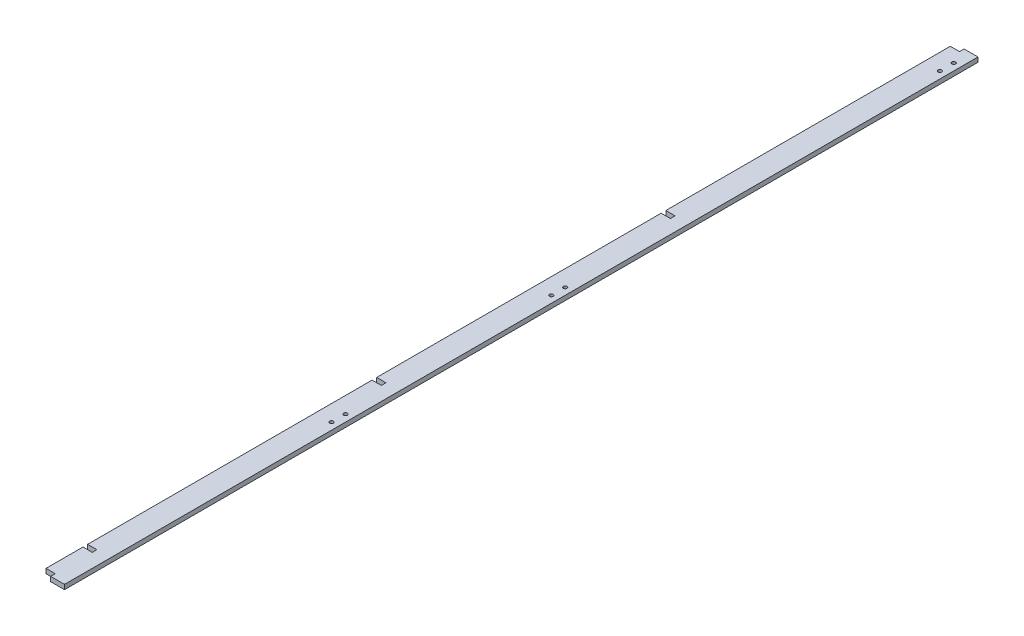
ISO-10303-21;
HEADER;
FILE_DESCRIPTION(('STEP AP214'),'2;1');
FILE_NAME('part.step','',(''),(''),'','','');
FILE_SCHEMA(('AUTOMOTIVE_DESIGN { 1 0 10303 214 1 1 1 1 }'));
ENDSEC;
DATA;
#1=APPLICATION_CONTEXT('core data for automotive mechanical design processes');
#2=APPLICATION_PROTOCOL_DEFINITION('international standard','automotive_design',2000,#1);
#3=PRODUCT_CONTEXT('',#1,'mechanical');
#4=PRODUCT('Part','Part','',(#3));
#5=PRODUCT_RELATED_PRODUCT_CATEGORY('part','',(#4));
#6=PRODUCT_DEFINITION_FORMATION('','',#4);
#7=PRODUCT_DEFINITION_CONTEXT('part definition',#1,'design');
#8=PRODUCT_DEFINITION('design','',#6,#7);
#9=PRODUCT_DEFINITION_SHAPE('','',#8);
#10=(LENGTH_UNIT() NAMED_UNIT(*) SI_UNIT(.MILLI.,.METRE.));
#11=(NAMED_UNIT(*) PLANE_ANGLE_UNIT() SI_UNIT($,.RADIAN.));
#12=(NAMED_UNIT(*) SI_UNIT($,.STERADIAN.) SOLID_ANGLE_UNIT());
#13=UNCERTAINTY_MEASURE_WITH_UNIT(LENGTH_MEASURE(1.E-05),#10,'distance_accuracy_value','');
#14=(GEOMETRIC_REPRESENTATION_CONTEXT(3) GLOBAL_UNCERTAINTY_ASSIGNED_CONTEXT((#13)) GLOBAL_UNIT_ASSIGNED_CONTEXT((#10,
#11,#12)) REPRESENTATION_CONTEXT('',''));
#15=CARTESIAN_POINT('',(0.,0.,0.));
#16=DIRECTION('',(0.,0.,1.));
#17=DIRECTION('',(1.,0.,0.));
#18=AXIS2_PLACEMENT_3D('',#15,#16,#17);
#19=CARTESIAN_POINT('',(120.787596037725,-3.38969409663407,765.01));
#20=DIRECTION('',(-1.,0.,0.));
#21=DIRECTION('',(0.,0.,1.));
#22=AXIS2_PLACEMENT_3D('',#19,#20,#21);
#23=PLANE('',#22);
#24=DIRECTION('',(0.,1.,0.));
#25=VECTOR('',#24,1.);
#26=CARTESIAN_POINT('',(120.787596037725,-5.38969409663407,767.01));
#27=LINE('',#26,#25);
#28=CARTESIAN_POINT('',(120.787596037725,-5.38969409663407,767.01));
#29=VERTEX_POINT('',#28);
#30=CARTESIAN_POINT('',(120.787596037725,-3.38969409663407,767.01));
#31=VERTEX_POINT('',#30);
#32=EDGE_CURVE('E185',#29,#31,#27,.T.);
#33=ORIENTED_EDGE('',*,*,#32,.F.);
#34=DIRECTION('',(0.,0.,1.));
#35=VECTOR('',#34,1.);
#36=CARTESIAN_POINT('',(120.787596037725,-5.38969409663407,765.01));
#37=LINE('',#36,#35);
#38=CARTESIAN_POINT('',(120.787596037726,-5.38969409663407,890.01));
#39=VERTEX_POINT('',#38);
#40=EDGE_CURVE('E50',#29,#39,#37,.T.);
#41=ORIENTED_EDGE('',*,*,#40,.T.);
#42=DIRECTION('',(0.,1.,0.));
#43=VECTOR('',#42,1.);
#44=CARTESIAN_POINT('',(120.787596037726,-5.38969409663407,890.01));
#45=LINE('',#44,#43);
#46=CARTESIAN_POINT('',(120.787596037726,-3.38969409663407,890.01));
#47=VERTEX_POINT('',#46);
#48=EDGE_CURVE('E292',#39,#47,#45,.T.);
#49=ORIENTED_EDGE('',*,*,#48,.T.);
#50=DIRECTION('',(0.,0.,1.));
#51=VECTOR('',#50,1.);
#52=CARTESIAN_POINT('',(120.787596037725,-3.38969409663407,765.01));
#53=LINE('',#52,#51);
#54=EDGE_CURVE('E200',#31,#47,#53,.T.);
#55=ORIENTED_EDGE('',*,*,#54,.F.);
#56=EDGE_LOOP('',(#33,#41,#49,#55));
#57=FACE_BOUND('',#56,.T.);
#58=ADVANCED_FACE('F41',(#57),#23,.T.);
#59=DIRECTION('',(0.,1.,0.));
#60=VECTOR('',#59,1.);
#61=CARTESIAN_POINT('',(120.787596037726,-5.38969409663407,892.01));
#62=LINE('',#61,#60);
#63=CARTESIAN_POINT('',(120.787596037726,-5.38969409663407,892.01));
#64=VERTEX_POINT('',#63);
#65=CARTESIAN_POINT('',(120.787596037725,-3.38969409663407,892.01));
#66=VERTEX_POINT('',#65);
#67=EDGE_CURVE('E307',#64,#66,#62,.T.);
#68=ORIENTED_EDGE('',*,*,#67,.F.);
#69=CARTESIAN_POINT('',(120.787596037728,-5.38969409663407,1015.01));
#70=VERTEX_POINT('',#69);
#71=EDGE_CURVE('E208',#64,#70,#37,.T.);
#72=ORIENTED_EDGE('',*,*,#71,.T.);
#73=DIRECTION('',(0.,1.,0.));
#74=VECTOR('',#73,1.);
#75=CARTESIAN_POINT('',(120.787596037728,-5.38969409663407,1015.01));
#76=LINE('',#75,#74);
#77=CARTESIAN_POINT('',(120.787596037728,-3.38969409663407,1015.01));
#78=VERTEX_POINT('',#77);
#79=EDGE_CURVE('E334',#70,#78,#76,.T.);
#80=ORIENTED_EDGE('',*,*,#79,.T.);
#81=EDGE_CURVE('E218',#66,#78,#53,.T.);
#82=ORIENTED_EDGE('',*,*,#81,.F.);
#83=EDGE_LOOP('',(#68,#72,#80,#82));
#84=FACE_BOUND('',#83,.T.);
#85=ADVANCED_FACE('F423',(#84),#23,.T.);
#86=DIRECTION('',(0.,1.,0.));
#87=VECTOR('',#86,1.);
#88=CARTESIAN_POINT('',(120.787596037728,-5.38969409663407,1017.01));
#89=LINE('',#88,#87);
#90=CARTESIAN_POINT('',(120.787596037728,-5.38969409663407,1017.01));
#91=VERTEX_POINT('',#90);
#92=CARTESIAN_POINT('',(120.787596037725,-3.38969409663407,1017.01));
#93=VERTEX_POINT('',#92);
#94=EDGE_CURVE('E66',#91,#93,#89,.T.);
#95=ORIENTED_EDGE('',*,*,#94,.F.);
#96=CARTESIAN_POINT('',(120.787596037729,-5.38969409663407,1140.01));
#97=VERTEX_POINT('',#96);
#98=EDGE_CURVE('E212',#91,#97,#37,.T.);
#99=ORIENTED_EDGE('',*,*,#98,.T.);
#100=DIRECTION('',(0.,1.,0.));
#101=VECTOR('',#100,1.);
#102=CARTESIAN_POINT('',(120.787596037729,-5.38969409663407,1140.01));
#103=LINE('',#102,#101);
#104=CARTESIAN_POINT('',(120.787596037729,-3.38969409663407,1140.01));
#105=VERTEX_POINT('',#104);
#106=EDGE_CURVE('E280',#97,#105,#103,.T.);
#107=ORIENTED_EDGE('',*,*,#106,.T.);
#108=EDGE_CURVE('E223',#93,#105,#53,.T.);
#109=ORIENTED_EDGE('',*,*,#108,.F.);
#110=EDGE_LOOP('',(#95,#99,#107,#109));
#111=FACE_BOUND('',#110,.T.);
#112=ADVANCED_FACE('F410',(#111),#23,.T.);
#113=CARTESIAN_POINT('',(130.787596037725,-3.38969409663407,765.01));
#114=DIRECTION('',(1.,0.,0.));
#115=DIRECTION('',(0.,0.,-1.));
#116=AXIS2_PLACEMENT_3D('',#113,#114,#115);
#117=PLANE('',#116);
#118=DIRECTION('',(0.,1.,0.));
#119=VECTOR('',#118,1.);
#120=CARTESIAN_POINT('',(130.787596037725,-3.38969409663407,1160.01));
#121=LINE('',#120,#119);
#122=CARTESIAN_POINT('',(130.787596037725,-5.38969409663407,1160.01));
#123=VERTEX_POINT('',#122);
#124=CARTESIAN_POINT('',(130.787596037725,-3.38969409663407,1160.01));
#125=VERTEX_POINT('',#124);
#126=EDGE_CURVE('E242',#123,#125,#121,.T.);
#127=ORIENTED_EDGE('',*,*,#126,.F.);
#128=DIRECTION('',(0.,0.,1.));
#129=VECTOR('',#128,1.);
#130=CARTESIAN_POINT('',(130.787596037725,-5.38969409663407,765.01));
#131=LINE('',#130,#129);
#132=CARTESIAN_POINT('',(130.787596037725,-5.38969409663407,765.01));
#133=VERTEX_POINT('',#132);
#134=EDGE_CURVE('E11',#133,#123,#131,.T.);
#135=ORIENTED_EDGE('',*,*,#134,.F.);
#136=DIRECTION('',(0.,1.,0.));
#137=VECTOR('',#136,1.);
#138=CARTESIAN_POINT('',(130.787596037725,-3.38969409663407,765.01));
#139=LINE('',#138,#137);
#140=CARTESIAN_POINT('',(130.787596037725,-3.38969409663407,765.01));
#141=VERTEX_POINT('',#140);
#142=EDGE_CURVE('E238',#133,#141,#139,.T.);
#143=ORIENTED_EDGE('',*,*,#142,.T.);
#144=DIRECTION('',(0.,0.,1.));
#145=VECTOR('',#144,1.);
#146=CARTESIAN_POINT('',(130.787596037725,-3.38969409663407,765.01));
#147=LINE('',#146,#145);
#148=EDGE_CURVE('E45',#141,#125,#147,.T.);
#149=ORIENTED_EDGE('',*,*,#148,.T.);
#150=EDGE_LOOP('',(#127,#135,#143,#149));
#151=FACE_BOUND('',#150,.T.);
#152=ADVANCED_FACE('F43',(#151),#117,.T.);
#153=CARTESIAN_POINT('',(130.787596037725,-5.38969409663407,765.01));
#154=DIRECTION('',(0.,-1.,0.));
#155=DIRECTION('',(0.,0.,-1.));
#156=AXIS2_PLACEMENT_3D('',#153,#154,#155);
#157=PLANE('',#156);
#158=DIRECTION('',(0.,0.,-1.));
#159=VECTOR('',#158,1.);
#160=CARTESIAN_POINT('',(124.787596037725,-5.38969409663407,765.01));
#161=LINE('',#160,#159);
#162=CARTESIAN_POINT('',(124.787596037725,-5.38969409663407,767.01));
#163=VERTEX_POINT('',#162);
#164=CARTESIAN_POINT('',(124.787596037725,-5.38969409663407,765.01));
#165=VERTEX_POINT('',#164);
#166=EDGE_CURVE('E192',#163,#165,#161,.T.);
#167=ORIENTED_EDGE('',*,*,#166,.T.);
#168=DIRECTION('',(1.,0.,0.));
#169=VECTOR('',#168,1.);
#170=CARTESIAN_POINT('',(130.787596037725,-5.38969409663407,765.01));
#171=LINE('',#170,#169);
#172=EDGE_CURVE('E228',#165,#133,#171,.T.);
#173=ORIENTED_EDGE('',*,*,#172,.T.);
#174=ORIENTED_EDGE('',*,*,#134,.T.);
#175=DIRECTION('',(1.,0.,0.));
#176=VECTOR('',#175,1.);
#177=CARTESIAN_POINT('',(130.787596037725,-5.38969409663407,1160.01));
#178=LINE('',#177,#176);
#179=CARTESIAN_POINT('',(124.787596037725,-5.38969409663407,1160.01));
#180=VERTEX_POINT('',#179);
#181=EDGE_CURVE('E249',#180,#123,#178,.T.);
#182=ORIENTED_EDGE('',*,*,#181,.F.);
#183=DIRECTION('',(0.,0.,-1.));
#184=VECTOR('',#183,1.);
#185=CARTESIAN_POINT('',(124.787596037725,-5.38969409663407,1160.01));
#186=LINE('',#185,#184);
#187=CARTESIAN_POINT('',(124.787596037725,-5.38969409663407,1158.01));
#188=VERTEX_POINT('',#187);
#189=EDGE_CURVE('E281',#180,#188,#186,.T.);
#190=ORIENTED_EDGE('',*,*,#189,.T.);
#191=DIRECTION('',(-1.,0.,0.));
#192=VECTOR('',#191,1.);
#193=CARTESIAN_POINT('',(124.787596037725,-5.38969409663407,1158.01));
#194=LINE('',#193,#192);
#195=CARTESIAN_POINT('',(120.787596037725,-5.38969409663407,1158.01));
#196=VERTEX_POINT('',#195);
#197=EDGE_CURVE('E285',#188,#196,#194,.T.);
#198=ORIENTED_EDGE('',*,*,#197,.T.);
#199=CARTESIAN_POINT('',(120.787596037729,-5.38969409663407,1142.01));
#200=VERTEX_POINT('',#199);
#201=EDGE_CURVE('E210',#200,#196,#37,.T.);
#202=ORIENTED_EDGE('',*,*,#201,.F.);
#203=DIRECTION('',(1.,0.,0.));
#204=VECTOR('',#203,1.);
#205=CARTESIAN_POINT('',(120.787596037729,-5.38969409663407,1142.01));
#206=LINE('',#205,#204);
#207=CARTESIAN_POINT('',(124.787596037729,-5.38969409663407,1142.01));
#208=VERTEX_POINT('',#207);
#209=EDGE_CURVE('E322',#200,#208,#206,.T.);
#210=ORIENTED_EDGE('',*,*,#209,.T.);
#211=DIRECTION('',(0.,0.,-1.));
#212=VECTOR('',#211,1.);
#213=CARTESIAN_POINT('',(124.787596037729,-5.38969409663407,1140.01));
#214=LINE('',#213,#212);
#215=CARTESIAN_POINT('',(124.787596037729,-5.38969409663407,1140.01));
#216=VERTEX_POINT('',#215);
#217=EDGE_CURVE('E326',#208,#216,#214,.T.);
#218=ORIENTED_EDGE('',*,*,#217,.T.);
#219=DIRECTION('',(-1.,0.,0.));
#220=VECTOR('',#219,1.);
#221=CARTESIAN_POINT('',(120.787596037729,-5.38969409663407,1140.01));
#222=LINE('',#221,#220);
#223=EDGE_CURVE('E329',#216,#97,#222,.T.);
#224=ORIENTED_EDGE('',*,*,#223,.T.);
#225=ORIENTED_EDGE('',*,*,#98,.F.);
#226=DIRECTION('',(1.,0.,0.));
#227=VECTOR('',#226,1.);
#228=CARTESIAN_POINT('',(120.787596037728,-5.38969409663407,1017.01));
#229=LINE('',#228,#227);
#230=CARTESIAN_POINT('',(124.787596037727,-5.38969409663407,1017.01));
#231=VERTEX_POINT('',#230);
#232=EDGE_CURVE('E346',#91,#231,#229,.T.);
#233=ORIENTED_EDGE('',*,*,#232,.T.);
#234=DIRECTION('',(0.,0.,-1.));
#235=VECTOR('',#234,1.);
#236=CARTESIAN_POINT('',(124.787596037727,-5.38969409663407,1015.01));
#237=LINE('',#236,#235);
#238=CARTESIAN_POINT('',(124.787596037727,-5.38969409663407,1015.01));
#239=VERTEX_POINT('',#238);
#240=EDGE_CURVE('E350',#231,#239,#237,.T.);
#241=ORIENTED_EDGE('',*,*,#240,.T.);
#242=DIRECTION('',(-1.,0.,0.));
#243=VECTOR('',#242,1.);
#244=CARTESIAN_POINT('',(120.787596037728,-5.38969409663407,1015.01));
#245=LINE('',#244,#243);
#246=EDGE_CURVE('E353',#239,#70,#245,.T.);
#247=ORIENTED_EDGE('',*,*,#246,.T.);
#248=ORIENTED_EDGE('',*,*,#71,.F.);
#249=DIRECTION('',(1.,0.,0.));
#250=VECTOR('',#249,1.);
#251=CARTESIAN_POINT('',(120.787596037726,-5.38969409663407,892.01));
#252=LINE('',#251,#250);
#253=CARTESIAN_POINT('',(124.787596037726,-5.38969409663407,892.01));
#254=VERTEX_POINT('',#253);
#255=EDGE_CURVE('E300',#64,#254,#252,.T.);
#256=ORIENTED_EDGE('',*,*,#255,.T.);
#257=DIRECTION('',(0.,0.,-1.));
#258=VECTOR('',#257,1.);
#259=CARTESIAN_POINT('',(124.787596037726,-5.38969409663407,890.01));
#260=LINE('',#259,#258);
#261=CARTESIAN_POINT('',(124.787596037726,-5.38969409663407,890.01));
#262=VERTEX_POINT('',#261);
#263=EDGE_CURVE('E304',#254,#262,#260,.T.);
#264=ORIENTED_EDGE('',*,*,#263,.T.);
#265=DIRECTION('',(-1.,0.,0.));
#266=VECTOR('',#265,1.);
#267=CARTESIAN_POINT('',(120.787596037726,-5.38969409663407,890.01));
#268=LINE('',#267,#266);
#269=EDGE_CURVE('E207',#262,#39,#268,.T.);
#270=ORIENTED_EDGE('',*,*,#269,.T.);
#271=ORIENTED_EDGE('',*,*,#40,.F.);
#272=DIRECTION('',(1.,0.,0.));
#273=VECTOR('',#272,1.);
#274=CARTESIAN_POINT('',(120.787596037725,-5.38969409663407,767.01));
#275=LINE('',#274,#273);
#276=EDGE_CURVE('E181',#29,#163,#275,.T.);
#277=ORIENTED_EDGE('',*,*,#276,.T.);
#278=EDGE_LOOP('',(#167,#173,#174,#182,#190,#198,#202,#210,#218,#224,#225,#233,#241,#247,#248,
#256,#264,#270,#271,#277));
#279=FACE_BOUND('',#278,.T.);
#280=CARTESIAN_POINT('',(127.787596037728,-5.38969409663407,1041.51));
#281=DIRECTION('',(0.,1.,0.));
#282=DIRECTION('',(-1.,0.,0.));
#283=AXIS2_PLACEMENT_3D('',#280,#281,#282);
#284=CIRCLE('',#283,0.799999999999957);
#285=CARTESIAN_POINT('',(126.987596037728,-5.38969409663407,1041.51));
#286=VERTEX_POINT('',#285);
#287=EDGE_CURVE('E368',#286,#286,#284,.T.);
#288=ORIENTED_EDGE('',*,*,#287,.T.);
#289=EDGE_LOOP('',(#288));
#290=FACE_BOUND('',#289,.T.);
#291=CARTESIAN_POINT('',(127.787596037728,-5.38969409663407,1035.51));
#292=DIRECTION('',(0.,1.,0.));
#293=DIRECTION('',(-1.,0.,0.));
#294=AXIS2_PLACEMENT_3D('',#291,#292,#293);
#295=CIRCLE('',#294,0.799999999999957);
#296=CARTESIAN_POINT('',(126.987596037728,-5.38969409663407,1035.51));
#297=VERTEX_POINT('',#296);
#298=EDGE_CURVE('E374',#297,#297,#295,.T.);
#299=ORIENTED_EDGE('',*,*,#298,.T.);
#300=EDGE_LOOP('',(#299));
#301=FACE_BOUND('',#300,.T.);
#302=CARTESIAN_POINT('',(127.787596037727,-5.38969409663407,946.51));
#303=DIRECTION('',(0.,1.,0.));
#304=DIRECTION('',(-1.,0.,0.));
#305=AXIS2_PLACEMENT_3D('',#302,#303,#304);
#306=CIRCLE('',#305,0.799999999999989);
#307=CARTESIAN_POINT('',(126.987596037727,-5.38969409663407,946.51));
#308=VERTEX_POINT('',#307);
#309=EDGE_CURVE('E255',#308,#308,#306,.T.);
#310=ORIENTED_EDGE('',*,*,#309,.T.);
#311=EDGE_LOOP('',(#310));
#312=FACE_BOUND('',#311,.T.);
#313=CARTESIAN_POINT('',(127.787596037727,-5.38969409663407,940.51));
#314=DIRECTION('',(0.,1.,0.));
#315=DIRECTION('',(-1.,0.,0.));
#316=AXIS2_PLACEMENT_3D('',#313,#314,#315);
#317=CIRCLE('',#316,0.799999999999989);
#318=CARTESIAN_POINT('',(126.987596037727,-5.38969409663407,940.51));
#319=VERTEX_POINT('',#318);
#320=EDGE_CURVE('E262',#319,#319,#317,.T.);
#321=ORIENTED_EDGE('',*,*,#320,.T.);
#322=EDGE_LOOP('',(#321));
#323=FACE_BOUND('',#322,.T.);
#324=CARTESIAN_POINT('',(127.787596037725,-5.38969409663407,778.51));
#325=DIRECTION('',(0.,1.,0.));
#326=DIRECTION('',(-1.,0.,0.));
#327=AXIS2_PLACEMENT_3D('',#324,#325,#326);
#328=CIRCLE('',#327,0.799999999999989);
#329=CARTESIAN_POINT('',(126.987596037725,-5.38969409663407,778.51));
#330=VERTEX_POINT('',#329);
#331=EDGE_CURVE('E268',#330,#330,#328,.T.);
#332=ORIENTED_EDGE('',*,*,#331,.T.);
#333=EDGE_LOOP('',(#332));
#334=FACE_BOUND('',#333,.T.);
#335=CARTESIAN_POINT('',(127.787596037725,-5.38969409663407,772.51));
#336=DIRECTION('',(0.,1.,0.));
#337=DIRECTION('',(-1.,0.,0.));
#338=AXIS2_PLACEMENT_3D('',#335,#336,#337);
#339=CIRCLE('',#338,0.799999999999989);
#340=CARTESIAN_POINT('',(126.987596037725,-5.38969409663407,772.51));
#341=VERTEX_POINT('',#340);
#342=EDGE_CURVE('E274',#341,#341,#339,.T.);
#343=ORIENTED_EDGE('',*,*,#342,.T.);
#344=EDGE_LOOP('',(#343));
#345=FACE_BOUND('',#344,.T.);
#346=ADVANCED_FACE('F203',(#279,#290,#301,#312,#323,#334,#345),#157,.T.);
#347=DIRECTION('',(0.,1.,0.));
#348=VECTOR('',#347,1.);
#349=CARTESIAN_POINT('',(120.787596037725,-5.38969409663407,1158.01));
#350=LINE('',#349,#348);
#351=CARTESIAN_POINT('',(120.787596037725,-3.38969409663407,1158.01));
#352=VERTEX_POINT('',#351);
#353=EDGE_CURVE('E296',#196,#352,#350,.T.);
#354=ORIENTED_EDGE('',*,*,#353,.T.);
#355=CARTESIAN_POINT('',(120.787596037725,-3.38969409663407,1142.01));
#356=VERTEX_POINT('',#355);
#357=EDGE_CURVE('E219',#356,#352,#53,.T.);
#358=ORIENTED_EDGE('',*,*,#357,.F.);
#359=DIRECTION('',(0.,1.,0.));
#360=VECTOR('',#359,1.);
#361=CARTESIAN_POINT('',(120.787596037729,-5.38969409663407,1142.01));
#362=LINE('',#361,#360);
#363=EDGE_CURVE('E58',#200,#356,#362,.T.);
#364=ORIENTED_EDGE('',*,*,#363,.F.);
#365=ORIENTED_EDGE('',*,*,#201,.T.);
#366=EDGE_LOOP('',(#354,#358,#364,#365));
#367=FACE_BOUND('',#366,.T.);
#368=ADVANCED_FACE('F398',(#367),#23,.T.);
#369=CARTESIAN_POINT('',(130.787596037725,-3.38969409663407,765.01));
#370=DIRECTION('',(0.,1.,0.));
#371=DIRECTION('',(-1.,0.,0.));
#372=AXIS2_PLACEMENT_3D('',#369,#370,#371);
#373=PLANE('',#372);
#374=DIRECTION('',(0.,0.,-1.));
#375=VECTOR('',#374,1.);
#376=CARTESIAN_POINT('',(124.787596037725,-3.38969409663407,765.01));
#377=LINE('',#376,#375);
#378=CARTESIAN_POINT('',(124.787596037725,-3.38969409663407,767.01));
#379=VERTEX_POINT('',#378);
#380=CARTESIAN_POINT('',(124.787596037725,-3.38969409663407,765.01));
#381=VERTEX_POINT('',#380);
#382=EDGE_CURVE('E193',#379,#381,#377,.T.);
#383=ORIENTED_EDGE('',*,*,#382,.F.);
#384=DIRECTION('',(1.,0.,0.));
#385=VECTOR('',#384,1.);
#386=CARTESIAN_POINT('',(120.787596037725,-3.38969409663407,767.01));
#387=LINE('',#386,#385);
#388=EDGE_CURVE('E311',#31,#379,#387,.T.);
#389=ORIENTED_EDGE('',*,*,#388,.F.);
#390=ORIENTED_EDGE('',*,*,#54,.T.);
#391=DIRECTION('',(-1.,0.,0.));
#392=VECTOR('',#391,1.);
#393=CARTESIAN_POINT('',(120.787596037726,-3.38969409663407,890.01));
#394=LINE('',#393,#392);
#395=CARTESIAN_POINT('',(124.787596037726,-3.38969409663407,890.01));
#396=VERTEX_POINT('',#395);
#397=EDGE_CURVE('E303',#396,#47,#394,.T.);
#398=ORIENTED_EDGE('',*,*,#397,.F.);
#399=DIRECTION('',(0.,0.,-1.));
#400=VECTOR('',#399,1.);
#401=CARTESIAN_POINT('',(124.787596037726,-3.38969409663407,890.01));
#402=LINE('',#401,#400);
#403=CARTESIAN_POINT('',(124.787596037726,-3.38969409663407,892.01));
#404=VERTEX_POINT('',#403);
#405=EDGE_CURVE('E312',#404,#396,#402,.T.);
#406=ORIENTED_EDGE('',*,*,#405,.F.);
#407=DIRECTION('',(1.,0.,0.));
#408=VECTOR('',#407,1.);
#409=CARTESIAN_POINT('',(120.787596037726,-3.38969409663407,892.01));
#410=LINE('',#409,#408);
#411=EDGE_CURVE('E308',#66,#404,#410,.T.);
#412=ORIENTED_EDGE('',*,*,#411,.F.);
#413=ORIENTED_EDGE('',*,*,#81,.T.);
#414=DIRECTION('',(-1.,0.,0.));
#415=VECTOR('',#414,1.);
#416=CARTESIAN_POINT('',(120.787596037728,-3.38969409663407,1015.01));
#417=LINE('',#416,#415);
#418=CARTESIAN_POINT('',(124.787596037727,-3.38969409663407,1015.01));
#419=VERTEX_POINT('',#418);
#420=EDGE_CURVE('E349',#419,#78,#417,.T.);
#421=ORIENTED_EDGE('',*,*,#420,.F.);
#422=DIRECTION('',(0.,0.,-1.));
#423=VECTOR('',#422,1.);
#424=CARTESIAN_POINT('',(124.787596037727,-3.38969409663407,1015.01));
#425=LINE('',#424,#423);
#426=CARTESIAN_POINT('',(124.787596037727,-3.38969409663407,1017.01));
#427=VERTEX_POINT('',#426);
#428=EDGE_CURVE('E357',#427,#419,#425,.T.);
#429=ORIENTED_EDGE('',*,*,#428,.F.);
#430=DIRECTION('',(1.,0.,0.));
#431=VECTOR('',#430,1.);
#432=CARTESIAN_POINT('',(120.787596037728,-3.38969409663407,1017.01));
#433=LINE('',#432,#431);
#434=EDGE_CURVE('E297',#93,#427,#433,.T.);
#435=ORIENTED_EDGE('',*,*,#434,.F.);
#436=ORIENTED_EDGE('',*,*,#108,.T.);
#437=DIRECTION('',(-1.,0.,0.));
#438=VECTOR('',#437,1.);
#439=CARTESIAN_POINT('',(120.787596037729,-3.38969409663407,1140.01));
#440=LINE('',#439,#438);
#441=CARTESIAN_POINT('',(124.787596037729,-3.38969409663407,1140.01));
#442=VERTEX_POINT('',#441);
#443=EDGE_CURVE('E325',#442,#105,#440,.T.);
#444=ORIENTED_EDGE('',*,*,#443,.F.);
#445=DIRECTION('',(0.,0.,-1.));
#446=VECTOR('',#445,1.);
#447=CARTESIAN_POINT('',(124.787596037729,-3.38969409663407,1140.01));
#448=LINE('',#447,#446);
#449=CARTESIAN_POINT('',(124.787596037729,-3.38969409663407,1142.01));
#450=VERTEX_POINT('',#449);
#451=EDGE_CURVE('E335',#450,#442,#448,.T.);
#452=ORIENTED_EDGE('',*,*,#451,.F.);
#453=DIRECTION('',(1.,0.,0.));
#454=VECTOR('',#453,1.);
#455=CARTESIAN_POINT('',(120.787596037729,-3.38969409663407,1142.01));
#456=LINE('',#455,#454);
#457=EDGE_CURVE('E332',#356,#450,#456,.T.);
#458=ORIENTED_EDGE('',*,*,#457,.F.);
#459=ORIENTED_EDGE('',*,*,#357,.T.);
#460=DIRECTION('',(-1.,0.,0.));
#461=VECTOR('',#460,1.);
#462=CARTESIAN_POINT('',(124.787596037725,-3.38969409663407,1158.01));
#463=LINE('',#462,#461);
#464=CARTESIAN_POINT('',(124.787596037725,-3.38969409663407,1158.01));
#465=VERTEX_POINT('',#464);
#466=EDGE_CURVE('E284',#465,#352,#463,.T.);
#467=ORIENTED_EDGE('',*,*,#466,.F.);
#468=DIRECTION('',(0.,0.,-1.));
#469=VECTOR('',#468,1.);
#470=CARTESIAN_POINT('',(124.787596037725,-3.38969409663407,1160.01));
#471=LINE('',#470,#469);
#472=CARTESIAN_POINT('',(124.787596037725,-3.38969409663407,1160.01));
#473=VERTEX_POINT('',#472);
#474=EDGE_CURVE('E289',#473,#465,#471,.T.);
#475=ORIENTED_EDGE('',*,*,#474,.F.);
#476=DIRECTION('',(-1.,0.,0.));
#477=VECTOR('',#476,1.);
#478=CARTESIAN_POINT('',(130.787596037725,-3.38969409663407,1160.01));
#479=LINE('',#478,#477);
#480=EDGE_CURVE('E245',#125,#473,#479,.T.);
#481=ORIENTED_EDGE('',*,*,#480,.F.);
#482=ORIENTED_EDGE('',*,*,#148,.F.);
#483=DIRECTION('',(-1.,0.,0.));
#484=VECTOR('',#483,1.);
#485=CARTESIAN_POINT('',(130.787596037725,-3.38969409663407,765.01));
#486=LINE('',#485,#484);
#487=EDGE_CURVE('E233',#141,#381,#486,.T.);
#488=ORIENTED_EDGE('',*,*,#487,.T.);
#489=EDGE_LOOP('',(#383,#389,#390,#398,#406,#412,#413,#421,#429,#435,#436,#444,#452,#458,#459,
#467,#475,#481,#482,#488));
#490=FACE_BOUND('',#489,.T.);
#491=CARTESIAN_POINT('',(127.787596037728,-3.38969409663407,1041.51));
#492=DIRECTION('',(0.,1.,0.));
#493=DIRECTION('',(-1.,0.,0.));
#494=AXIS2_PLACEMENT_3D('',#491,#492,#493);
#495=CIRCLE('',#494,0.799999999999957);
#496=CARTESIAN_POINT('',(126.987596037728,-3.38969409663407,1041.51));
#497=VERTEX_POINT('',#496);
#498=EDGE_CURVE('E371',#497,#497,#495,.T.);
#499=ORIENTED_EDGE('',*,*,#498,.F.);
#500=EDGE_LOOP('',(#499));
#501=FACE_BOUND('',#500,.T.);
#502=CARTESIAN_POINT('',(127.787596037728,-3.38969409663407,1035.51));
#503=DIRECTION('',(0.,1.,0.));
#504=DIRECTION('',(-1.,0.,0.));
#505=AXIS2_PLACEMENT_3D('',#502,#503,#504);
#506=CIRCLE('',#505,0.799999999999957);
#507=CARTESIAN_POINT('',(126.987596037728,-3.38969409663407,1035.51));
#508=VERTEX_POINT('',#507);
#509=EDGE_CURVE('E259',#508,#508,#506,.T.);
#510=ORIENTED_EDGE('',*,*,#509,.F.);
#511=EDGE_LOOP('',(#510));
#512=FACE_BOUND('',#511,.T.);
#513=CARTESIAN_POINT('',(127.787596037727,-3.38969409663407,946.51));
#514=DIRECTION('',(0.,1.,0.));
#515=DIRECTION('',(-1.,0.,0.));
#516=AXIS2_PLACEMENT_3D('',#513,#514,#515);
#517=CIRCLE('',#516,0.799999999999989);
#518=CARTESIAN_POINT('',(126.987596037727,-3.38969409663407,946.51));
#519=VERTEX_POINT('',#518);
#520=EDGE_CURVE('E258',#519,#519,#517,.T.);
#521=ORIENTED_EDGE('',*,*,#520,.F.);
#522=EDGE_LOOP('',(#521));
#523=FACE_BOUND('',#522,.T.);
#524=CARTESIAN_POINT('',(127.787596037727,-3.38969409663407,940.51));
#525=DIRECTION('',(0.,1.,0.));
#526=DIRECTION('',(-1.,0.,0.));
#527=AXIS2_PLACEMENT_3D('',#524,#525,#526);
#528=CIRCLE('',#527,0.799999999999989);
#529=CARTESIAN_POINT('',(126.987596037727,-3.38969409663407,940.51));
#530=VERTEX_POINT('',#529);
#531=EDGE_CURVE('E265',#530,#530,#528,.T.);
#532=ORIENTED_EDGE('',*,*,#531,.F.);
#533=EDGE_LOOP('',(#532));
#534=FACE_BOUND('',#533,.T.);
#535=CARTESIAN_POINT('',(127.787596037725,-3.38969409663407,778.51));
#536=DIRECTION('',(0.,1.,0.));
#537=DIRECTION('',(-1.,0.,0.));
#538=AXIS2_PLACEMENT_3D('',#535,#536,#537);
#539=CIRCLE('',#538,0.799999999999989);
#540=CARTESIAN_POINT('',(126.987596037725,-3.38969409663407,778.51));
#541=VERTEX_POINT('',#540);
#542=EDGE_CURVE('E271',#541,#541,#539,.T.);
#543=ORIENTED_EDGE('',*,*,#542,.F.);
#544=EDGE_LOOP('',(#543));
#545=FACE_BOUND('',#544,.T.);
#546=CARTESIAN_POINT('',(127.787596037725,-3.38969409663407,772.51));
#547=DIRECTION('',(0.,1.,0.));
#548=DIRECTION('',(-1.,0.,0.));
#549=AXIS2_PLACEMENT_3D('',#546,#547,#548);
#550=CIRCLE('',#549,0.799999999999989);
#551=CARTESIAN_POINT('',(126.987596037725,-3.38969409663407,772.51));
#552=VERTEX_POINT('',#551);
#553=EDGE_CURVE('E277',#552,#552,#550,.T.);
#554=ORIENTED_EDGE('',*,*,#553,.F.);
#555=EDGE_LOOP('',(#554));
#556=FACE_BOUND('',#555,.T.);
#557=ADVANCED_FACE('F389',(#490,#501,#512,#523,#534,#545,#556),#373,.T.);
#558=CARTESIAN_POINT('',(0.,0.,765.01));
#559=DIRECTION('',(0.,0.,-1.));
#560=DIRECTION('',(-1.,0.,0.));
#561=AXIS2_PLACEMENT_3D('',#558,#559,#560);
#562=PLANE('',#561);
#563=DIRECTION('',(0.,1.,0.));
#564=VECTOR('',#563,1.);
#565=CARTESIAN_POINT('',(124.787596037725,-5.38969409663407,765.01));
#566=LINE('',#565,#564);
#567=EDGE_CURVE('E246',#165,#381,#566,.T.);
#568=ORIENTED_EDGE('',*,*,#567,.T.);
#569=ORIENTED_EDGE('',*,*,#487,.F.);
#570=ORIENTED_EDGE('',*,*,#142,.F.);
#571=ORIENTED_EDGE('',*,*,#172,.F.);
#572=EDGE_LOOP('',(#568,#569,#570,#571));
#573=FACE_BOUND('',#572,.T.);
#574=ADVANCED_FACE('F386',(#573),#562,.T.);
#575=CARTESIAN_POINT('',(0.,0.,1160.01));
#576=DIRECTION('',(0.,0.,-1.));
#577=DIRECTION('',(-1.,0.,0.));
#578=AXIS2_PLACEMENT_3D('',#575,#576,#577);
#579=PLANE('',#578);
#580=ORIENTED_EDGE('',*,*,#480,.T.);
#581=DIRECTION('',(0.,1.,0.));
#582=VECTOR('',#581,1.);
#583=CARTESIAN_POINT('',(124.787596037725,-5.38969409663407,1160.01));
#584=LINE('',#583,#582);
#585=EDGE_CURVE('E294',#180,#473,#584,.T.);
#586=ORIENTED_EDGE('',*,*,#585,.F.);
#587=ORIENTED_EDGE('',*,*,#181,.T.);
#588=ORIENTED_EDGE('',*,*,#126,.T.);
#589=EDGE_LOOP('',(#580,#586,#587,#588));
#590=FACE_BOUND('',#589,.T.);
#591=ADVANCED_FACE('F392',(#590),#579,.F.);
#592=CARTESIAN_POINT('',(124.787596037725,-5.38969409663407,1160.01));
#593=DIRECTION('',(1.,0.,0.));
#594=DIRECTION('',(0.,1.,0.));
#595=AXIS2_PLACEMENT_3D('',#592,#593,#594);
#596=PLANE('',#595);
#597=ORIENTED_EDGE('',*,*,#474,.T.);
#598=DIRECTION('',(0.,1.,0.));
#599=VECTOR('',#598,1.);
#600=CARTESIAN_POINT('',(124.787596037725,-5.38969409663407,1158.01));
#601=LINE('',#600,#599);
#602=EDGE_CURVE('E288',#188,#465,#601,.T.);
#603=ORIENTED_EDGE('',*,*,#602,.F.);
#604=ORIENTED_EDGE('',*,*,#189,.F.);
#605=ORIENTED_EDGE('',*,*,#585,.T.);
#606=EDGE_LOOP('',(#597,#603,#604,#605));
#607=FACE_BOUND('',#606,.T.);
#608=ADVANCED_FACE('F395',(#607),#596,.F.);
#609=CARTESIAN_POINT('',(124.787596037725,-5.38969409663407,1158.01));
#610=DIRECTION('',(0.,0.,-1.));
#611=DIRECTION('',(-1.,0.,0.));
#612=AXIS2_PLACEMENT_3D('',#609,#610,#611);
#613=PLANE('',#612);
#614=ORIENTED_EDGE('',*,*,#466,.T.);
#615=ORIENTED_EDGE('',*,*,#353,.F.);
#616=ORIENTED_EDGE('',*,*,#197,.F.);
#617=ORIENTED_EDGE('',*,*,#602,.T.);
#618=EDGE_LOOP('',(#614,#615,#616,#617));
#619=FACE_BOUND('',#618,.T.);
#620=ADVANCED_FACE('F397',(#619),#613,.F.);
#621=CARTESIAN_POINT('',(124.787596037725,-5.38969409663407,765.01));
#622=DIRECTION('',(1.,0.,0.));
#623=DIRECTION('',(0.,0.,-1.));
#624=AXIS2_PLACEMENT_3D('',#621,#622,#623);
#625=PLANE('',#624);
#626=ORIENTED_EDGE('',*,*,#382,.T.);
#627=ORIENTED_EDGE('',*,*,#567,.F.);
#628=ORIENTED_EDGE('',*,*,#166,.F.);
#629=DIRECTION('',(0.,1.,0.));
#630=VECTOR('',#629,1.);
#631=CARTESIAN_POINT('',(124.787596037725,-5.38969409663407,767.01));
#632=LINE('',#631,#630);
#633=EDGE_CURVE('E187',#163,#379,#632,.T.);
#634=ORIENTED_EDGE('',*,*,#633,.T.);
#635=EDGE_LOOP('',(#626,#627,#628,#634));
#636=FACE_BOUND('',#635,.T.);
#637=ADVANCED_FACE('F523',(#636),#625,.F.);
#638=CARTESIAN_POINT('',(120.787596037725,-5.38969409663407,767.01));
#639=DIRECTION('',(0.,0.,1.));
#640=DIRECTION('',(1.,0.,0.));
#641=AXIS2_PLACEMENT_3D('',#638,#639,#640);
#642=PLANE('',#641);
#643=ORIENTED_EDGE('',*,*,#388,.T.);
#644=ORIENTED_EDGE('',*,*,#633,.F.);
#645=ORIENTED_EDGE('',*,*,#276,.F.);
#646=ORIENTED_EDGE('',*,*,#32,.T.);
#647=EDGE_LOOP('',(#643,#644,#645,#646));
#648=FACE_BOUND('',#647,.T.);
#649=ADVANCED_FACE('F184',(#648),#642,.F.);
#650=CARTESIAN_POINT('',(120.787596037729,-5.38969409663407,1140.01));
#651=DIRECTION('',(0.,0.,-1.));
#652=DIRECTION('',(-1.,0.,0.));
#653=AXIS2_PLACEMENT_3D('',#650,#651,#652);
#654=PLANE('',#653);
#655=ORIENTED_EDGE('',*,*,#443,.T.);
#656=ORIENTED_EDGE('',*,*,#106,.F.);
#657=ORIENTED_EDGE('',*,*,#223,.F.);
#658=DIRECTION('',(0.,1.,0.));
#659=VECTOR('',#658,1.);
#660=CARTESIAN_POINT('',(124.787596037729,-5.38969409663407,1140.01));
#661=LINE('',#660,#659);
#662=EDGE_CURVE('E341',#216,#442,#661,.T.);
#663=ORIENTED_EDGE('',*,*,#662,.T.);
#664=EDGE_LOOP('',(#655,#656,#657,#663));
#665=FACE_BOUND('',#664,.T.);
#666=ADVANCED_FACE('F407',(#665),#654,.F.);
#667=CARTESIAN_POINT('',(124.787596037729,-5.38969409663407,1140.01));
#668=DIRECTION('',(1.,0.,0.));
#669=DIRECTION('',(0.,0.,-1.));
#670=AXIS2_PLACEMENT_3D('',#667,#668,#669);
#671=PLANE('',#670);
#672=ORIENTED_EDGE('',*,*,#451,.T.);
#673=ORIENTED_EDGE('',*,*,#662,.F.);
#674=ORIENTED_EDGE('',*,*,#217,.F.);
#675=DIRECTION('',(0.,1.,0.));
#676=VECTOR('',#675,1.);
#677=CARTESIAN_POINT('',(124.787596037729,-5.38969409663407,1142.01));
#678=LINE('',#677,#676);
#679=EDGE_CURVE('E343',#208,#450,#678,.T.);
#680=ORIENTED_EDGE('',*,*,#679,.T.);
#681=EDGE_LOOP('',(#672,#673,#674,#680));
#682=FACE_BOUND('',#681,.T.);
#683=ADVANCED_FACE('F403',(#682),#671,.F.);
#684=CARTESIAN_POINT('',(120.787596037729,-5.38969409663407,1142.01));
#685=DIRECTION('',(0.,0.,1.));
#686=DIRECTION('',(1.,0.,0.));
#687=AXIS2_PLACEMENT_3D('',#684,#685,#686);
#688=PLANE('',#687);
#689=ORIENTED_EDGE('',*,*,#457,.T.);
#690=ORIENTED_EDGE('',*,*,#679,.F.);
#691=ORIENTED_EDGE('',*,*,#209,.F.);
#692=ORIENTED_EDGE('',*,*,#363,.T.);
#693=EDGE_LOOP('',(#689,#690,#691,#692));
#694=FACE_BOUND('',#693,.T.);
#695=ADVANCED_FACE('F400',(#694),#688,.F.);
#696=CARTESIAN_POINT('',(120.787596037728,-5.38969409663407,1015.01));
#697=DIRECTION('',(0.,0.,-1.));
#698=DIRECTION('',(-1.,0.,0.));
#699=AXIS2_PLACEMENT_3D('',#696,#697,#698);
#700=PLANE('',#699);
#701=ORIENTED_EDGE('',*,*,#420,.T.);
#702=ORIENTED_EDGE('',*,*,#79,.F.);
#703=ORIENTED_EDGE('',*,*,#246,.F.);
#704=DIRECTION('',(0.,1.,0.));
#705=VECTOR('',#704,1.);
#706=CARTESIAN_POINT('',(124.787596037727,-5.38969409663407,1015.01));
#707=LINE('',#706,#705);
#708=EDGE_CURVE('E363',#239,#419,#707,.T.);
#709=ORIENTED_EDGE('',*,*,#708,.T.);
#710=EDGE_LOOP('',(#701,#702,#703,#709));
#711=FACE_BOUND('',#710,.T.);
#712=ADVANCED_FACE('F564',(#711),#700,.F.);
#713=CARTESIAN_POINT('',(124.787596037727,-5.38969409663407,1015.01));
#714=DIRECTION('',(1.,0.,0.));
#715=DIRECTION('',(0.,0.,-1.));
#716=AXIS2_PLACEMENT_3D('',#713,#714,#715);
#717=PLANE('',#716);
#718=ORIENTED_EDGE('',*,*,#428,.T.);
#719=ORIENTED_EDGE('',*,*,#708,.F.);
#720=ORIENTED_EDGE('',*,*,#240,.F.);
#721=DIRECTION('',(0.,1.,0.));
#722=VECTOR('',#721,1.);
#723=CARTESIAN_POINT('',(124.787596037727,-5.38969409663407,1017.01));
#724=LINE('',#723,#722);
#725=EDGE_CURVE('E365',#231,#427,#724,.T.);
#726=ORIENTED_EDGE('',*,*,#725,.T.);
#727=EDGE_LOOP('',(#718,#719,#720,#726));
#728=FACE_BOUND('',#727,.T.);
#729=ADVANCED_FACE('F417',(#728),#717,.F.);
#730=CARTESIAN_POINT('',(120.787596037728,-5.38969409663407,1017.01));
#731=DIRECTION('',(0.,0.,1.));
#732=DIRECTION('',(1.,0.,0.));
#733=AXIS2_PLACEMENT_3D('',#730,#731,#732);
#734=PLANE('',#733);
#735=ORIENTED_EDGE('',*,*,#434,.T.);
#736=ORIENTED_EDGE('',*,*,#725,.F.);
#737=ORIENTED_EDGE('',*,*,#232,.F.);
#738=ORIENTED_EDGE('',*,*,#94,.T.);
#739=EDGE_LOOP('',(#735,#736,#737,#738));
#740=FACE_BOUND('',#739,.T.);
#741=ADVANCED_FACE('F414',(#740),#734,.F.);
#742=CARTESIAN_POINT('',(120.787596037726,-5.38969409663407,890.01));
#743=DIRECTION('',(0.,0.,-1.));
#744=DIRECTION('',(-1.,0.,0.));
#745=AXIS2_PLACEMENT_3D('',#742,#743,#744);
#746=PLANE('',#745);
#747=ORIENTED_EDGE('',*,*,#397,.T.);
#748=ORIENTED_EDGE('',*,*,#48,.F.);
#749=ORIENTED_EDGE('',*,*,#269,.F.);
#750=DIRECTION('',(0.,1.,0.));
#751=VECTOR('',#750,1.);
#752=CARTESIAN_POINT('',(124.787596037726,-5.38969409663407,890.01));
#753=LINE('',#752,#751);
#754=EDGE_CURVE('E317',#262,#396,#753,.T.);
#755=ORIENTED_EDGE('',*,*,#754,.T.);
#756=EDGE_LOOP('',(#747,#748,#749,#755));
#757=FACE_BOUND('',#756,.T.);
#758=ADVANCED_FACE('F433',(#757),#746,.F.);
#759=CARTESIAN_POINT('',(124.787596037726,-5.38969409663407,890.01));
#760=DIRECTION('',(1.,0.,0.));
#761=DIRECTION('',(0.,0.,-1.));
#762=AXIS2_PLACEMENT_3D('',#759,#760,#761);
#763=PLANE('',#762);
#764=ORIENTED_EDGE('',*,*,#405,.T.);
#765=ORIENTED_EDGE('',*,*,#754,.F.);
#766=ORIENTED_EDGE('',*,*,#263,.F.);
#767=DIRECTION('',(0.,1.,0.));
#768=VECTOR('',#767,1.);
#769=CARTESIAN_POINT('',(124.787596037726,-5.38969409663407,892.01));
#770=LINE('',#769,#768);
#771=EDGE_CURVE('E319',#254,#404,#770,.T.);
#772=ORIENTED_EDGE('',*,*,#771,.T.);
#773=EDGE_LOOP('',(#764,#765,#766,#772));
#774=FACE_BOUND('',#773,.T.);
#775=ADVANCED_FACE('F430',(#774),#763,.F.);
#776=CARTESIAN_POINT('',(120.787596037726,-5.38969409663407,892.01));
#777=DIRECTION('',(0.,0.,1.));
#778=DIRECTION('',(1.,0.,0.));
#779=AXIS2_PLACEMENT_3D('',#776,#777,#778);
#780=PLANE('',#779);
#781=ORIENTED_EDGE('',*,*,#411,.T.);
#782=ORIENTED_EDGE('',*,*,#771,.F.);
#783=ORIENTED_EDGE('',*,*,#255,.F.);
#784=ORIENTED_EDGE('',*,*,#67,.T.);
#785=EDGE_LOOP('',(#781,#782,#783,#784));
#786=FACE_BOUND('',#785,.T.);
#787=ADVANCED_FACE('F427',(#786),#780,.F.);
#788=CARTESIAN_POINT('',(127.787596037725,-5.38969409663407,772.51));
#789=DIRECTION('',(0.,1.,0.));
#790=DIRECTION('',(-1.,0.,0.));
#791=AXIS2_PLACEMENT_3D('',#788,#789,#790);
#792=CYLINDRICAL_SURFACE('',#791,0.799999999999989);
#793=ORIENTED_EDGE('',*,*,#342,.F.);
#794=EDGE_LOOP('',(#793));
#795=FACE_BOUND('',#794,.T.);
#796=ORIENTED_EDGE('',*,*,#553,.T.);
#797=EDGE_LOOP('',(#796));
#798=FACE_BOUND('',#797,.T.);
#799=ADVANCED_FACE('F605',(#795,#798),#792,.F.);
#800=CARTESIAN_POINT('',(127.787596037725,-5.38969409663407,778.51));
#801=DIRECTION('',(0.,1.,0.));
#802=DIRECTION('',(-1.,0.,0.));
#803=AXIS2_PLACEMENT_3D('',#800,#801,#802);
#804=CYLINDRICAL_SURFACE('',#803,0.799999999999989);
#805=ORIENTED_EDGE('',*,*,#331,.F.);
#806=EDGE_LOOP('',(#805));
#807=FACE_BOUND('',#806,.T.);
#808=ORIENTED_EDGE('',*,*,#542,.T.);
#809=EDGE_LOOP('',(#808));
#810=FACE_BOUND('',#809,.T.);
#811=ADVANCED_FACE('F614',(#807,#810),#804,.F.);
#812=CARTESIAN_POINT('',(127.787596037727,-5.38969409663407,940.51));
#813=DIRECTION('',(0.,1.,0.));
#814=DIRECTION('',(-1.,0.,0.));
#815=AXIS2_PLACEMENT_3D('',#812,#813,#814);
#816=CYLINDRICAL_SURFACE('',#815,0.799999999999989);
#817=ORIENTED_EDGE('',*,*,#320,.F.);
#818=EDGE_LOOP('',(#817));
#819=FACE_BOUND('',#818,.T.);
#820=ORIENTED_EDGE('',*,*,#531,.T.);
#821=EDGE_LOOP('',(#820));
#822=FACE_BOUND('',#821,.T.);
#823=ADVANCED_FACE('F624',(#819,#822),#816,.F.);
#824=CARTESIAN_POINT('',(127.787596037727,-5.38969409663407,946.51));
#825=DIRECTION('',(0.,1.,0.));
#826=DIRECTION('',(-1.,0.,0.));
#827=AXIS2_PLACEMENT_3D('',#824,#825,#826);
#828=CYLINDRICAL_SURFACE('',#827,0.799999999999989);
#829=ORIENTED_EDGE('',*,*,#309,.F.);
#830=EDGE_LOOP('',(#829));
#831=FACE_BOUND('',#830,.T.);
#832=ORIENTED_EDGE('',*,*,#520,.T.);
#833=EDGE_LOOP('',(#832));
#834=FACE_BOUND('',#833,.T.);
#835=ADVANCED_FACE('F634',(#831,#834),#828,.F.);
#836=CARTESIAN_POINT('',(127.787596037728,-5.38969409663407,1035.51));
#837=DIRECTION('',(0.,1.,0.));
#838=DIRECTION('',(-1.,0.,0.));
#839=AXIS2_PLACEMENT_3D('',#836,#837,#838);
#840=CYLINDRICAL_SURFACE('',#839,0.799999999999957);
#841=ORIENTED_EDGE('',*,*,#298,.F.);
#842=EDGE_LOOP('',(#841));
#843=FACE_BOUND('',#842,.T.);
#844=ORIENTED_EDGE('',*,*,#509,.T.);
#845=EDGE_LOOP('',(#844));
#846=FACE_BOUND('',#845,.T.);
#847=ADVANCED_FACE('F644',(#843,#846),#840,.F.);
#848=CARTESIAN_POINT('',(127.787596037728,-5.38969409663407,1041.51));
#849=DIRECTION('',(0.,1.,0.));
#850=DIRECTION('',(-1.,0.,0.));
#851=AXIS2_PLACEMENT_3D('',#848,#849,#850);
#852=CYLINDRICAL_SURFACE('',#851,0.799999999999957);
#853=ORIENTED_EDGE('',*,*,#287,.F.);
#854=EDGE_LOOP('',(#853));
#855=FACE_BOUND('',#854,.T.);
#856=ORIENTED_EDGE('',*,*,#498,.T.);
#857=EDGE_LOOP('',(#856));
#858=FACE_BOUND('',#857,.T.);
#859=ADVANCED_FACE('F654',(#855,#858),#852,.F.);
#860=CLOSED_SHELL('',(#58,#85,#112,#152,#346,#368,#557,#574,#591,#608,#620,#637,#649,#666,#683,
#695,#712,#729,#741,#758,#775,#787,#799,#811,#823,#835,#847,#859));
#861=MANIFOLD_SOLID_BREP('B2',#860);
#862=ADVANCED_BREP_SHAPE_REPRESENTATION('',(#18,#861),#14);
#863=SHAPE_DEFINITION_REPRESENTATION(#9,#862);
ENDSEC;
END-ISO-10303-21;
